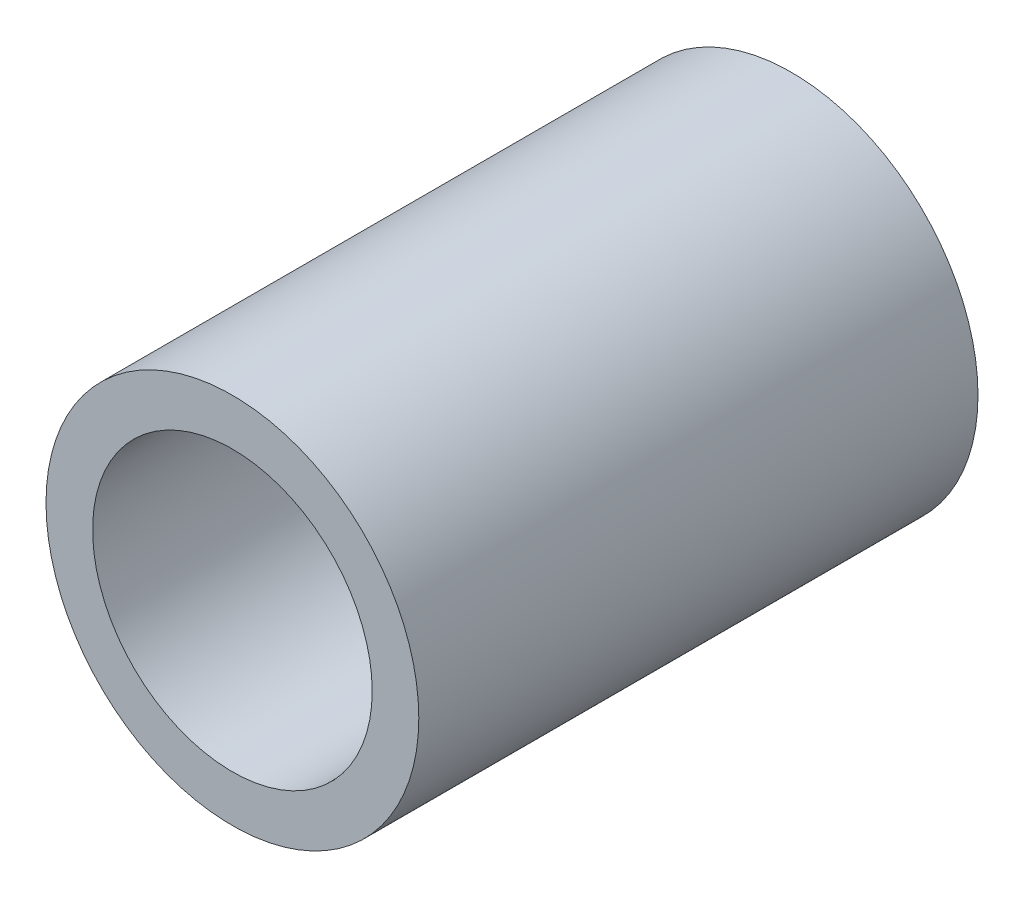
ISO-10303-21;
HEADER;
FILE_DESCRIPTION(('STEP AP214'),'2;1');
FILE_NAME('part.step','',(''),(''),'','','');
FILE_SCHEMA(('AUTOMOTIVE_DESIGN { 1 0 10303 214 1 1 1 1 }'));
ENDSEC;
DATA;
#1=APPLICATION_CONTEXT('core data for automotive mechanical design processes');
#2=APPLICATION_PROTOCOL_DEFINITION('international standard','automotive_design',2000,#1);
#3=PRODUCT_CONTEXT('',#1,'mechanical');
#4=PRODUCT('Part','Part','',(#3));
#5=PRODUCT_RELATED_PRODUCT_CATEGORY('part','',(#4));
#6=PRODUCT_DEFINITION_FORMATION('','',#4);
#7=PRODUCT_DEFINITION_CONTEXT('part definition',#1,'design');
#8=PRODUCT_DEFINITION('design','',#6,#7);
#9=PRODUCT_DEFINITION_SHAPE('','',#8);
#10=(LENGTH_UNIT() NAMED_UNIT(*) SI_UNIT(.MILLI.,.METRE.));
#11=(NAMED_UNIT(*) PLANE_ANGLE_UNIT() SI_UNIT($,.RADIAN.));
#12=(NAMED_UNIT(*) SI_UNIT($,.STERADIAN.) SOLID_ANGLE_UNIT());
#13=UNCERTAINTY_MEASURE_WITH_UNIT(LENGTH_MEASURE(1.E-05),#10,'distance_accuracy_value','');
#14=(GEOMETRIC_REPRESENTATION_CONTEXT(3) GLOBAL_UNCERTAINTY_ASSIGNED_CONTEXT((#13)) GLOBAL_UNIT_ASSIGNED_CONTEXT((#10,
#11,#12)) REPRESENTATION_CONTEXT('',''));
#15=CARTESIAN_POINT('',(0.,0.,0.));
#16=DIRECTION('',(0.,0.,1.));
#17=DIRECTION('',(1.,0.,0.));
#18=AXIS2_PLACEMENT_3D('',#15,#16,#17);
#19=CARTESIAN_POINT('',(0.,0.,18.));
#20=DIRECTION('',(0.,0.,1.));
#21=DIRECTION('',(1.,0.,0.));
#22=AXIS2_PLACEMENT_3D('',#19,#20,#21);
#23=PLANE('',#22);
#24=CARTESIAN_POINT('',(0.,0.,18.));
#25=DIRECTION('',(0.,0.,1.));
#26=DIRECTION('',(1.,0.,0.));
#27=AXIS2_PLACEMENT_3D('',#24,#25,#26);
#28=CIRCLE('',#27,6.);
#29=CARTESIAN_POINT('',(6.,0.,18.));
#30=VERTEX_POINT('',#29);
#31=EDGE_CURVE('E10',#30,#30,#28,.T.);
#32=ORIENTED_EDGE('',*,*,#31,.T.);
#33=EDGE_LOOP('',(#32));
#34=FACE_BOUND('',#33,.T.);
#35=CARTESIAN_POINT('',(0.,0.,18.));
#36=DIRECTION('',(0.,0.,1.));
#37=DIRECTION('',(1.,0.,0.));
#38=AXIS2_PLACEMENT_3D('',#35,#36,#37);
#39=CIRCLE('',#38,4.5);
#40=CARTESIAN_POINT('',(4.5,0.,18.));
#41=VERTEX_POINT('',#40);
#42=EDGE_CURVE('E40',#41,#41,#39,.T.);
#43=ORIENTED_EDGE('',*,*,#42,.F.);
#44=EDGE_LOOP('',(#43));
#45=FACE_BOUND('',#44,.T.);
#46=ADVANCED_FACE('F29',(#34,#45),#23,.T.);
#47=CARTESIAN_POINT('',(0.,0.,0.));
#48=DIRECTION('',(0.,0.,1.));
#49=DIRECTION('',(1.,0.,0.));
#50=AXIS2_PLACEMENT_3D('',#47,#48,#49);
#51=PLANE('',#50);
#52=CARTESIAN_POINT('',(0.,0.,0.));
#53=DIRECTION('',(0.,0.,1.));
#54=DIRECTION('',(1.,0.,0.));
#55=AXIS2_PLACEMENT_3D('',#52,#53,#54);
#56=CIRCLE('',#55,6.);
#57=CARTESIAN_POINT('',(6.,0.,0.));
#58=VERTEX_POINT('',#57);
#59=EDGE_CURVE('E36',#58,#58,#56,.T.);
#60=ORIENTED_EDGE('',*,*,#59,.F.);
#61=EDGE_LOOP('',(#60));
#62=FACE_BOUND('',#61,.T.);
#63=CARTESIAN_POINT('',(0.,0.,0.));
#64=DIRECTION('',(0.,0.,1.));
#65=DIRECTION('',(1.,0.,0.));
#66=AXIS2_PLACEMENT_3D('',#63,#64,#65);
#67=CIRCLE('',#66,4.5);
#68=CARTESIAN_POINT('',(4.5,0.,0.));
#69=VERTEX_POINT('',#68);
#70=EDGE_CURVE('E44',#69,#69,#67,.T.);
#71=ORIENTED_EDGE('',*,*,#70,.T.);
#72=EDGE_LOOP('',(#71));
#73=FACE_BOUND('',#72,.T.);
#74=ADVANCED_FACE('F50',(#62,#73),#51,.F.);
#75=CARTESIAN_POINT('',(0.,0.,18.));
#76=DIRECTION('',(0.,0.,-1.));
#77=DIRECTION('',(-1.,0.,0.));
#78=AXIS2_PLACEMENT_3D('',#75,#76,#77);
#79=CYLINDRICAL_SURFACE('',#78,6.);
#80=ORIENTED_EDGE('',*,*,#31,.F.);
#81=EDGE_LOOP('',(#80));
#82=FACE_BOUND('',#81,.T.);
#83=ORIENTED_EDGE('',*,*,#59,.T.);
#84=EDGE_LOOP('',(#83));
#85=FACE_BOUND('',#84,.T.);
#86=ADVANCED_FACE('F31',(#82,#85),#79,.T.);
#87=CARTESIAN_POINT('',(0.,0.,18.));
#88=DIRECTION('',(0.,0.,-1.));
#89=DIRECTION('',(-1.,0.,0.));
#90=AXIS2_PLACEMENT_3D('',#87,#88,#89);
#91=CYLINDRICAL_SURFACE('',#90,4.5);
#92=ORIENTED_EDGE('',*,*,#42,.T.);
#93=EDGE_LOOP('',(#92));
#94=FACE_BOUND('',#93,.T.);
#95=ORIENTED_EDGE('',*,*,#70,.F.);
#96=EDGE_LOOP('',(#95));
#97=FACE_BOUND('',#96,.T.);
#98=ADVANCED_FACE('F52',(#94,#97),#91,.F.);
#99=CLOSED_SHELL('',(#46,#74,#86,#98));
#100=MANIFOLD_SOLID_BREP('B2',#99);
#101=ADVANCED_BREP_SHAPE_REPRESENTATION('',(#18,#100),#14);
#102=SHAPE_DEFINITION_REPRESENTATION(#9,#101);
ENDSEC;
END-ISO-10303-21;
